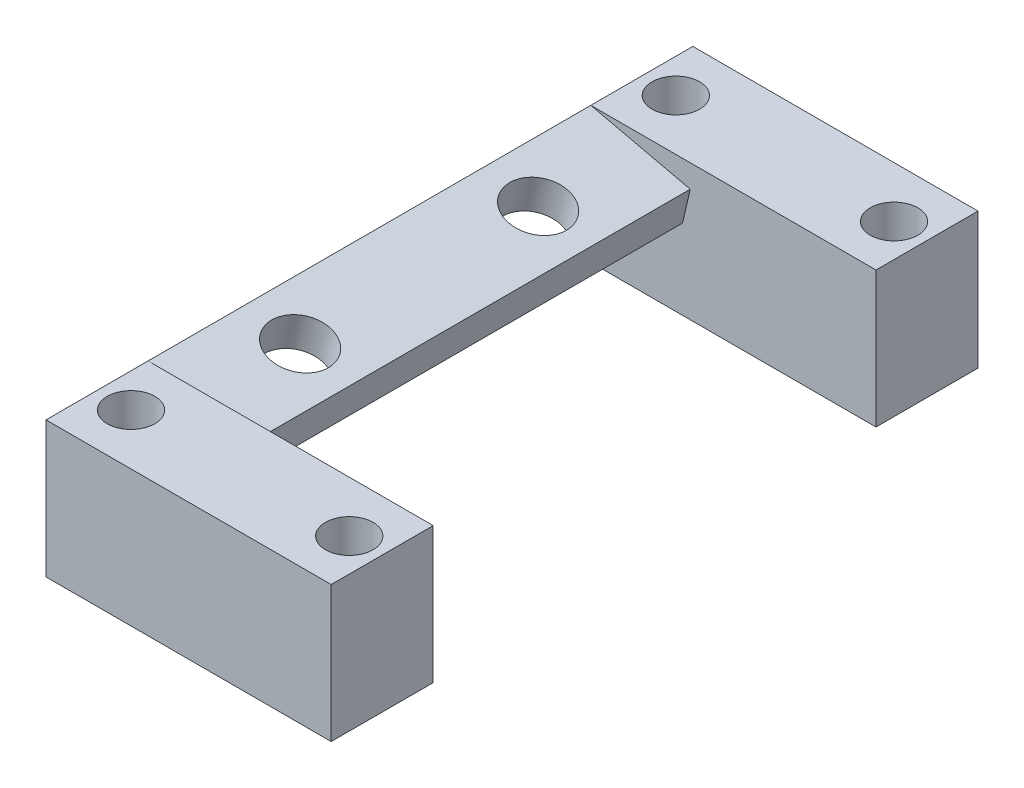
ISO-10303-21;
HEADER;
FILE_DESCRIPTION(('STEP AP214'),'2;1');
FILE_NAME('part.step','',(''),(''),'','','');
FILE_SCHEMA(('AUTOMOTIVE_DESIGN { 1 0 10303 214 1 1 1 1 }'));
ENDSEC;
DATA;
#1=APPLICATION_CONTEXT('core data for automotive mechanical design processes');
#2=APPLICATION_PROTOCOL_DEFINITION('international standard','automotive_design',2000,#1);
#3=PRODUCT_CONTEXT('',#1,'mechanical');
#4=PRODUCT('Part','Part','',(#3));
#5=PRODUCT_RELATED_PRODUCT_CATEGORY('part','',(#4));
#6=PRODUCT_DEFINITION_FORMATION('','',#4);
#7=PRODUCT_DEFINITION_CONTEXT('part definition',#1,'design');
#8=PRODUCT_DEFINITION('design','',#6,#7);
#9=PRODUCT_DEFINITION_SHAPE('','',#8);
#10=(LENGTH_UNIT() NAMED_UNIT(*) SI_UNIT(.MILLI.,.METRE.));
#11=(NAMED_UNIT(*) PLANE_ANGLE_UNIT() SI_UNIT($,.RADIAN.));
#12=(NAMED_UNIT(*) SI_UNIT($,.STERADIAN.) SOLID_ANGLE_UNIT());
#13=UNCERTAINTY_MEASURE_WITH_UNIT(LENGTH_MEASURE(1.E-05),#10,'distance_accuracy_value','');
#14=(GEOMETRIC_REPRESENTATION_CONTEXT(3) GLOBAL_UNCERTAINTY_ASSIGNED_CONTEXT((#13)) GLOBAL_UNIT_ASSIGNED_CONTEXT((#10,
#11,#12)) REPRESENTATION_CONTEXT('',''));
#15=CARTESIAN_POINT('',(0.,0.,0.));
#16=DIRECTION('',(0.,0.,1.));
#17=DIRECTION('',(1.,0.,0.));
#18=AXIS2_PLACEMENT_3D('',#15,#16,#17);
#19=CARTESIAN_POINT('',(-35.7075481721267,20.8555254386624,-40.6908));
#20=DIRECTION('',(1.,0.,0.));
#21=DIRECTION('',(0.,0.,-1.));
#22=AXIS2_PLACEMENT_3D('',#19,#20,#21);
#23=PLANE('',#22);
#24=DIRECTION('',(0.,1.,0.));
#25=VECTOR('',#24,1.);
#26=CARTESIAN_POINT('',(-35.7075481721267,20.8555254386624,-33.0708));
#27=LINE('',#26,#25);
#28=CARTESIAN_POINT('',(-35.7075481721267,10.6955254386624,-33.0708));
#29=VERTEX_POINT('',#28);
#30=CARTESIAN_POINT('',(-35.7075481721267,20.8555254386624,-33.0708));
#31=VERTEX_POINT('',#30);
#32=EDGE_CURVE('E106',#29,#31,#27,.T.);
#33=ORIENTED_EDGE('',*,*,#32,.T.);
#34=DIRECTION('',(0.,0.,1.));
#35=VECTOR('',#34,1.);
#36=CARTESIAN_POINT('',(-35.7075481721267,20.8555254386624,-40.6908));
#37=LINE('',#36,#35);
#38=CARTESIAN_POINT('',(-35.7075481721267,20.8555254386624,-40.6908));
#39=VERTEX_POINT('',#38);
#40=EDGE_CURVE('E12',#39,#31,#37,.T.);
#41=ORIENTED_EDGE('',*,*,#40,.F.);
#42=DIRECTION('',(0.,1.,0.));
#43=VECTOR('',#42,1.);
#44=CARTESIAN_POINT('',(-35.7075481721267,20.8555254386624,-40.6908));
#45=LINE('',#44,#43);
#46=CARTESIAN_POINT('',(-35.7075481721267,10.6955254386624,-40.6908));
#47=VERTEX_POINT('',#46);
#48=EDGE_CURVE('E94',#47,#39,#45,.T.);
#49=ORIENTED_EDGE('',*,*,#48,.F.);
#50=DIRECTION('',(0.,0.,1.));
#51=VECTOR('',#50,1.);
#52=CARTESIAN_POINT('',(-35.7075481721267,10.6955254386624,-40.6908));
#53=LINE('',#52,#51);
#54=EDGE_CURVE('E102',#47,#29,#53,.T.);
#55=ORIENTED_EDGE('',*,*,#54,.T.);
#56=EDGE_LOOP('',(#33,#41,#49,#55));
#57=FACE_BOUND('',#56,.T.);
#58=ADVANCED_FACE('F43',(#57),#23,.F.);
#59=CARTESIAN_POINT('',(-35.7075481721267,20.8555254386624,-40.6908));
#60=DIRECTION('',(0.,-1.,0.));
#61=DIRECTION('',(1.,0.,0.));
#62=AXIS2_PLACEMENT_3D('',#59,#60,#61);
#63=PLANE('',#62);
#64=CARTESIAN_POINT('',(-33.1675481721267,20.8555254386624,-36.8808));
#65=DIRECTION('',(0.,1.,0.));
#66=DIRECTION('',(-1.,0.,0.));
#67=AXIS2_PLACEMENT_3D('',#64,#65,#66);
#68=CIRCLE('',#67,1.778);
#69=CARTESIAN_POINT('',(-34.9455481721267,20.8555254386624,-36.8808));
#70=VERTEX_POINT('',#69);
#71=EDGE_CURVE('E126',#70,#70,#68,.T.);
#72=ORIENTED_EDGE('',*,*,#71,.F.);
#73=EDGE_LOOP('',(#72));
#74=FACE_BOUND('',#73,.T.);
#75=CARTESIAN_POINT('',(-16.8675477521267,20.8555254386624,-36.8808));
#76=DIRECTION('',(0.,1.,0.));
#77=DIRECTION('',(-1.,0.,0.));
#78=AXIS2_PLACEMENT_3D('',#75,#76,#77);
#79=CIRCLE('',#78,1.778);
#80=CARTESIAN_POINT('',(-18.6455477521267,20.8555254386624,-36.8808));
#81=VERTEX_POINT('',#80);
#82=EDGE_CURVE('E120',#81,#81,#79,.T.);
#83=ORIENTED_EDGE('',*,*,#82,.F.);
#84=EDGE_LOOP('',(#83));
#85=FACE_BOUND('',#84,.T.);
#86=DIRECTION('',(1.,0.,0.));
#87=VECTOR('',#86,1.);
#88=CARTESIAN_POINT('',(-35.7075481721267,20.8555254386624,-33.0708));
#89=LINE('',#88,#87);
#90=CARTESIAN_POINT('',(-14.4075475921267,20.8555254386624,-33.0708));
#91=VERTEX_POINT('',#90);
#92=EDGE_CURVE('E98',#31,#91,#89,.T.);
#93=ORIENTED_EDGE('',*,*,#92,.T.);
#94=DIRECTION('',(0.,0.,1.));
#95=VECTOR('',#94,1.);
#96=CARTESIAN_POINT('',(-14.4075475921267,20.8555254386624,-40.6908));
#97=LINE('',#96,#95);
#98=CARTESIAN_POINT('',(-14.4075475921267,20.8555254386624,-40.6908));
#99=VERTEX_POINT('',#98);
#100=EDGE_CURVE('E51',#99,#91,#97,.T.);
#101=ORIENTED_EDGE('',*,*,#100,.F.);
#102=DIRECTION('',(1.,0.,0.));
#103=VECTOR('',#102,1.);
#104=CARTESIAN_POINT('',(-35.7075481721267,20.8555254386624,-40.6908));
#105=LINE('',#104,#103);
#106=EDGE_CURVE('E89',#39,#99,#105,.T.);
#107=ORIENTED_EDGE('',*,*,#106,.F.);
#108=ORIENTED_EDGE('',*,*,#40,.T.);
#109=EDGE_LOOP('',(#93,#101,#107,#108));
#110=FACE_BOUND('',#109,.T.);
#111=ADVANCED_FACE('F97',(#74,#85,#110),#63,.F.);
#112=CARTESIAN_POINT('',(-14.4075475921267,20.8555254386624,-40.6908));
#113=DIRECTION('',(-1.,0.,0.));
#114=DIRECTION('',(0.,0.,1.));
#115=AXIS2_PLACEMENT_3D('',#112,#113,#114);
#116=PLANE('',#115);
#117=DIRECTION('',(0.,-1.,0.));
#118=VECTOR('',#117,1.);
#119=CARTESIAN_POINT('',(-14.4075475921267,20.8555254386624,-33.0708));
#120=LINE('',#119,#118);
#121=CARTESIAN_POINT('',(-14.4075475921267,10.6955254386624,-33.0708));
#122=VERTEX_POINT('',#121);
#123=EDGE_CURVE('E76',#91,#122,#120,.T.);
#124=ORIENTED_EDGE('',*,*,#123,.T.);
#125=DIRECTION('',(0.,0.,1.));
#126=VECTOR('',#125,1.);
#127=CARTESIAN_POINT('',(-14.4075475921267,10.6955254386624,-40.6908));
#128=LINE('',#127,#126);
#129=CARTESIAN_POINT('',(-14.4075475921267,10.6955254386624,-40.6908));
#130=VERTEX_POINT('',#129);
#131=EDGE_CURVE('E99',#130,#122,#128,.T.);
#132=ORIENTED_EDGE('',*,*,#131,.F.);
#133=DIRECTION('',(0.,-1.,0.));
#134=VECTOR('',#133,1.);
#135=CARTESIAN_POINT('',(-14.4075475921267,20.8555254386624,-40.6908));
#136=LINE('',#135,#134);
#137=EDGE_CURVE('E92',#99,#130,#136,.T.);
#138=ORIENTED_EDGE('',*,*,#137,.F.);
#139=ORIENTED_EDGE('',*,*,#100,.T.);
#140=EDGE_LOOP('',(#124,#132,#138,#139));
#141=FACE_BOUND('',#140,.T.);
#142=ADVANCED_FACE('F100',(#141),#116,.F.);
#143=CARTESIAN_POINT('',(-35.7075481721267,10.6955254386624,-40.6908));
#144=DIRECTION('',(0.,1.,0.));
#145=DIRECTION('',(-1.,0.,0.));
#146=AXIS2_PLACEMENT_3D('',#143,#144,#145);
#147=PLANE('',#146);
#148=CARTESIAN_POINT('',(-33.1675481721267,10.6955254386624,-36.8808));
#149=DIRECTION('',(0.,1.,0.));
#150=DIRECTION('',(-1.,0.,0.));
#151=AXIS2_PLACEMENT_3D('',#148,#149,#150);
#152=CIRCLE('',#151,1.778);
#153=CARTESIAN_POINT('',(-34.9455481721267,10.6955254386624,-36.8808));
#154=VERTEX_POINT('',#153);
#155=EDGE_CURVE('E109',#154,#154,#152,.T.);
#156=ORIENTED_EDGE('',*,*,#155,.T.);
#157=EDGE_LOOP('',(#156));
#158=FACE_BOUND('',#157,.T.);
#159=CARTESIAN_POINT('',(-16.8675477521267,10.6955254386624,-36.8808));
#160=DIRECTION('',(0.,1.,0.));
#161=DIRECTION('',(-1.,0.,0.));
#162=AXIS2_PLACEMENT_3D('',#159,#160,#161);
#163=CIRCLE('',#162,1.778);
#164=CARTESIAN_POINT('',(-18.6455477521267,10.6955254386624,-36.8808));
#165=VERTEX_POINT('',#164);
#166=EDGE_CURVE('E123',#165,#165,#163,.T.);
#167=ORIENTED_EDGE('',*,*,#166,.T.);
#168=EDGE_LOOP('',(#167));
#169=FACE_BOUND('',#168,.T.);
#170=DIRECTION('',(-1.,0.,0.));
#171=VECTOR('',#170,1.);
#172=CARTESIAN_POINT('',(-35.7075481721267,10.6955254386624,-33.0708));
#173=LINE('',#172,#171);
#174=EDGE_CURVE('E82',#122,#29,#173,.T.);
#175=ORIENTED_EDGE('',*,*,#174,.T.);
#176=ORIENTED_EDGE('',*,*,#54,.F.);
#177=DIRECTION('',(-1.,0.,0.));
#178=VECTOR('',#177,1.);
#179=CARTESIAN_POINT('',(-35.7075481721267,10.6955254386624,-40.6908));
#180=LINE('',#179,#178);
#181=EDGE_CURVE('E59',#130,#47,#180,.T.);
#182=ORIENTED_EDGE('',*,*,#181,.F.);
#183=ORIENTED_EDGE('',*,*,#131,.T.);
#184=EDGE_LOOP('',(#175,#176,#182,#183));
#185=FACE_BOUND('',#184,.T.);
#186=ADVANCED_FACE('F114',(#158,#169,#185),#147,.F.);
#187=CARTESIAN_POINT('',(0.,0.,-40.6908));
#188=DIRECTION('',(0.,0.,1.));
#189=DIRECTION('',(1.,0.,0.));
#190=AXIS2_PLACEMENT_3D('',#187,#188,#189);
#191=PLANE('',#190);
#192=ORIENTED_EDGE('',*,*,#48,.T.);
#193=ORIENTED_EDGE('',*,*,#106,.T.);
#194=ORIENTED_EDGE('',*,*,#137,.T.);
#195=ORIENTED_EDGE('',*,*,#181,.T.);
#196=EDGE_LOOP('',(#192,#193,#194,#195));
#197=FACE_BOUND('',#196,.T.);
#198=ADVANCED_FACE('F90',(#197),#191,.F.);
#199=CARTESIAN_POINT('',(0.,0.,-33.0708));
#200=DIRECTION('',(0.,0.,1.));
#201=DIRECTION('',(1.,0.,0.));
#202=AXIS2_PLACEMENT_3D('',#199,#200,#201);
#203=PLANE('',#202);
#204=ORIENTED_EDGE('',*,*,#32,.F.);
#205=ORIENTED_EDGE('',*,*,#174,.F.);
#206=ORIENTED_EDGE('',*,*,#123,.F.);
#207=ORIENTED_EDGE('',*,*,#92,.F.);
#208=EDGE_LOOP('',(#204,#205,#206,#207));
#209=FACE_BOUND('',#208,.T.);
#210=ADVANCED_FACE('F117',(#209),#203,.T.);
#211=CARTESIAN_POINT('',(-16.8675477521267,10.6955254386624,-36.8808));
#212=DIRECTION('',(0.,1.,0.));
#213=DIRECTION('',(-1.,0.,0.));
#214=AXIS2_PLACEMENT_3D('',#211,#212,#213);
#215=CYLINDRICAL_SURFACE('',#214,1.778);
#216=ORIENTED_EDGE('',*,*,#166,.F.);
#217=EDGE_LOOP('',(#216));
#218=FACE_BOUND('',#217,.T.);
#219=ORIENTED_EDGE('',*,*,#82,.T.);
#220=EDGE_LOOP('',(#219));
#221=FACE_BOUND('',#220,.T.);
#222=ADVANCED_FACE('F137',(#218,#221),#215,.F.);
#223=CARTESIAN_POINT('',(-33.1675481721267,10.6955254386624,-36.8808));
#224=DIRECTION('',(0.,1.,0.));
#225=DIRECTION('',(-1.,0.,0.));
#226=AXIS2_PLACEMENT_3D('',#223,#224,#225);
#227=CYLINDRICAL_SURFACE('',#226,1.778);
#228=ORIENTED_EDGE('',*,*,#155,.F.);
#229=EDGE_LOOP('',(#228));
#230=FACE_BOUND('',#229,.T.);
#231=ORIENTED_EDGE('',*,*,#71,.T.);
#232=EDGE_LOOP('',(#231));
#233=FACE_BOUND('',#232,.T.);
#234=ADVANCED_FACE('F134',(#230,#233),#227,.F.);
#235=CLOSED_SHELL('',(#58,#111,#142,#186,#198,#210,#222,#234));
#236=MANIFOLD_SOLID_BREP('B2',#235);
#237=CARTESIAN_POINT('',(0.,0.,0.));
#238=DIRECTION('',(0.,0.,1.));
#239=DIRECTION('',(1.,0.,0.));
#240=AXIS2_PLACEMENT_3D('',#237,#238,#239);
#241=PLANE('',#240);
#242=DIRECTION('',(0.974370064785235,-0.224951054343866,0.));
#243=VECTOR('',#242,1.);
#244=CARTESIAN_POINT('',(-28.2828482784633,19.1413984045622,0.));
#245=LINE('',#244,#243);
#246=CARTESIAN_POINT('',(-35.7075481721267,20.8555254386624,0.));
#247=VERTEX_POINT('',#246);
#248=CARTESIAN_POINT('',(-28.2828482784633,19.1413984045622,0.));
#249=VERTEX_POINT('',#248);
#250=EDGE_CURVE('E292',#247,#249,#245,.T.);
#251=ORIENTED_EDGE('',*,*,#250,.F.);
#252=DIRECTION('',(-1.,0.,0.));
#253=VECTOR('',#252,1.);
#254=CARTESIAN_POINT('',(-35.7075481721267,20.8555254386624,0.));
#255=LINE('',#254,#253);
#256=CARTESIAN_POINT('',(-14.4075475921267,20.8555254386624,0.));
#257=VERTEX_POINT('',#256);
#258=EDGE_CURVE('E307',#257,#247,#255,.T.);
#259=ORIENTED_EDGE('',*,*,#258,.F.);
#260=DIRECTION('',(0.,1.,0.));
#261=VECTOR('',#260,1.);
#262=CARTESIAN_POINT('',(-14.4075475921267,20.8555254386624,0.));
#263=LINE('',#262,#261);
#264=CARTESIAN_POINT('',(-14.4075475921267,10.6955254386624,0.));
#265=VERTEX_POINT('',#264);
#266=EDGE_CURVE('E316',#265,#257,#263,.T.);
#267=ORIENTED_EDGE('',*,*,#266,.F.);
#268=DIRECTION('',(1.,0.,0.));
#269=VECTOR('',#268,1.);
#270=CARTESIAN_POINT('',(-35.7075481721267,10.6955254386624,0.));
#271=LINE('',#270,#269);
#272=CARTESIAN_POINT('',(-35.7075481721267,10.6955254386624,0.));
#273=VERTEX_POINT('',#272);
#274=EDGE_CURVE('E314',#273,#265,#271,.T.);
#275=ORIENTED_EDGE('',*,*,#274,.F.);
#276=DIRECTION('',(0.,-1.,0.));
#277=VECTOR('',#276,1.);
#278=CARTESIAN_POINT('',(-35.7075481721267,20.8555254386624,0.));
#279=LINE('',#278,#277);
#280=CARTESIAN_POINT('',(-35.7075481721267,18.2487130048672,0.));
#281=VERTEX_POINT('',#280);
#282=EDGE_CURVE('E295',#281,#273,#279,.T.);
#283=ORIENTED_EDGE('',*,*,#282,.F.);
#284=DIRECTION('',(-0.974370064785235,0.224951054343865,0.));
#285=VECTOR('',#284,1.);
#286=CARTESIAN_POINT('',(-28.8542239564967,16.6664984400077,0.));
#287=LINE('',#286,#285);
#288=CARTESIAN_POINT('',(-28.8542239564967,16.6664984400077,0.));
#289=VERTEX_POINT('',#288);
#290=EDGE_CURVE('E229',#289,#281,#287,.T.);
#291=ORIENTED_EDGE('',*,*,#290,.F.);
#292=DIRECTION('',(-0.224951054343866,-0.974370064785235,0.));
#293=VECTOR('',#292,1.);
#294=CARTESIAN_POINT('',(-28.2828482784633,19.1413984045622,0.));
#295=LINE('',#294,#293);
#296=EDGE_CURVE('E224',#249,#289,#295,.T.);
#297=ORIENTED_EDGE('',*,*,#296,.F.);
#298=EDGE_LOOP('',(#251,#259,#267,#275,#283,#291,#297));
#299=FACE_BOUND('',#298,.T.);
#300=ADVANCED_FACE('F209',(#299),#241,.F.);
#301=CARTESIAN_POINT('',(-35.7075481721267,20.8555254386624,7.62));
#302=DIRECTION('',(1.,0.,0.));
#303=DIRECTION('',(0.,1.,0.));
#304=AXIS2_PLACEMENT_3D('',#301,#302,#303);
#305=PLANE('',#304);
#306=EDGE_CURVE('E297',#247,#281,#279,.T.);
#307=ORIENTED_EDGE('',*,*,#306,.T.);
#308=ORIENTED_EDGE('',*,*,#282,.T.);
#309=DIRECTION('',(0.,0.,-1.));
#310=VECTOR('',#309,1.);
#311=CARTESIAN_POINT('',(-35.7075481721267,10.6955254386624,7.62));
#312=LINE('',#311,#310);
#313=CARTESIAN_POINT('',(-35.7075481721267,10.6955254386624,7.62));
#314=VERTEX_POINT('',#313);
#315=EDGE_CURVE('E41',#314,#273,#312,.T.);
#316=ORIENTED_EDGE('',*,*,#315,.F.);
#317=DIRECTION('',(0.,-1.,0.));
#318=VECTOR('',#317,1.);
#319=CARTESIAN_POINT('',(-35.7075481721267,20.8555254386624,7.62));
#320=LINE('',#319,#318);
#321=CARTESIAN_POINT('',(-35.7075481721267,20.8555254386624,7.62));
#322=VERTEX_POINT('',#321);
#323=EDGE_CURVE('E303',#322,#314,#320,.T.);
#324=ORIENTED_EDGE('',*,*,#323,.F.);
#325=DIRECTION('',(0.,0.,-1.));
#326=VECTOR('',#325,1.);
#327=CARTESIAN_POINT('',(-35.7075481721267,20.8555254386624,7.62));
#328=LINE('',#327,#326);
#329=EDGE_CURVE('E312',#322,#247,#328,.T.);
#330=ORIENTED_EDGE('',*,*,#329,.T.);
#331=EDGE_LOOP('',(#307,#308,#316,#324,#330));
#332=FACE_BOUND('',#331,.T.);
#333=ADVANCED_FACE('F211',(#332),#305,.F.);
#334=CARTESIAN_POINT('',(-35.7075481721267,10.6955254386624,7.62));
#335=DIRECTION('',(0.,1.,0.));
#336=DIRECTION('',(0.,0.,1.));
#337=AXIS2_PLACEMENT_3D('',#334,#335,#336);
#338=PLANE('',#337);
#339=CARTESIAN_POINT('',(-33.1675481721267,10.6955254386624,3.81));
#340=DIRECTION('',(0.,1.,0.));
#341=DIRECTION('',(0.,0.,1.));
#342=AXIS2_PLACEMENT_3D('',#339,#340,#341);
#343=CIRCLE('',#342,1.778);
#344=CARTESIAN_POINT('',(-33.1675481721267,10.6955254386624,5.588));
#345=VERTEX_POINT('',#344);
#346=EDGE_CURVE('E362',#345,#345,#343,.T.);
#347=ORIENTED_EDGE('',*,*,#346,.T.);
#348=EDGE_LOOP('',(#347));
#349=FACE_BOUND('',#348,.T.);
#350=CARTESIAN_POINT('',(-16.8675477521267,10.6955254386624,3.81));
#351=DIRECTION('',(0.,1.,0.));
#352=DIRECTION('',(0.,0.,1.));
#353=AXIS2_PLACEMENT_3D('',#350,#351,#352);
#354=CIRCLE('',#353,1.778);
#355=CARTESIAN_POINT('',(-16.8675477521267,10.6955254386624,5.588));
#356=VERTEX_POINT('',#355);
#357=EDGE_CURVE('E368',#356,#356,#354,.T.);
#358=ORIENTED_EDGE('',*,*,#357,.T.);
#359=EDGE_LOOP('',(#358));
#360=FACE_BOUND('',#359,.T.);
#361=ORIENTED_EDGE('',*,*,#274,.T.);
#362=DIRECTION('',(0.,0.,-1.));
#363=VECTOR('',#362,1.);
#364=CARTESIAN_POINT('',(-14.4075475921267,10.6955254386624,7.62));
#365=LINE('',#364,#363);
#366=CARTESIAN_POINT('',(-14.4075475921267,10.6955254386624,7.62));
#367=VERTEX_POINT('',#366);
#368=EDGE_CURVE('E217',#367,#265,#365,.T.);
#369=ORIENTED_EDGE('',*,*,#368,.F.);
#370=DIRECTION('',(1.,0.,0.));
#371=VECTOR('',#370,1.);
#372=CARTESIAN_POINT('',(-35.7075481721267,10.6955254386624,7.62));
#373=LINE('',#372,#371);
#374=EDGE_CURVE('E306',#314,#367,#373,.T.);
#375=ORIENTED_EDGE('',*,*,#374,.F.);
#376=ORIENTED_EDGE('',*,*,#315,.T.);
#377=EDGE_LOOP('',(#361,#369,#375,#376));
#378=FACE_BOUND('',#377,.T.);
#379=ADVANCED_FACE('F419',(#349,#360,#378),#338,.F.);
#380=CARTESIAN_POINT('',(-14.4075475921267,20.8555254386624,7.62));
#381=DIRECTION('',(-1.,0.,0.));
#382=DIRECTION('',(0.,-1.,0.));
#383=AXIS2_PLACEMENT_3D('',#380,#381,#382);
#384=PLANE('',#383);
#385=ORIENTED_EDGE('',*,*,#266,.T.);
#386=DIRECTION('',(0.,0.,-1.));
#387=VECTOR('',#386,1.);
#388=CARTESIAN_POINT('',(-14.4075475921267,20.8555254386624,7.62));
#389=LINE('',#388,#387);
#390=CARTESIAN_POINT('',(-14.4075475921267,20.8555254386624,7.62));
#391=VERTEX_POINT('',#390);
#392=EDGE_CURVE('E322',#391,#257,#389,.T.);
#393=ORIENTED_EDGE('',*,*,#392,.F.);
#394=DIRECTION('',(0.,1.,0.));
#395=VECTOR('',#394,1.);
#396=CARTESIAN_POINT('',(-14.4075475921267,20.8555254386624,7.62));
#397=LINE('',#396,#395);
#398=EDGE_CURVE('E309',#367,#391,#397,.T.);
#399=ORIENTED_EDGE('',*,*,#398,.F.);
#400=ORIENTED_EDGE('',*,*,#368,.T.);
#401=EDGE_LOOP('',(#385,#393,#399,#400));
#402=FACE_BOUND('',#401,.T.);
#403=ADVANCED_FACE('F329',(#402),#384,.F.);
#404=CARTESIAN_POINT('',(-35.7075481721267,20.8555254386624,7.62));
#405=DIRECTION('',(0.,-1.,0.));
#406=DIRECTION('',(0.,0.,-1.));
#407=AXIS2_PLACEMENT_3D('',#404,#405,#406);
#408=PLANE('',#407);
#409=CARTESIAN_POINT('',(-33.1675481721267,20.8555254386624,3.81));
#410=DIRECTION('',(0.,1.,0.));
#411=DIRECTION('',(0.,0.,1.));
#412=AXIS2_PLACEMENT_3D('',#409,#410,#411);
#413=CIRCLE('',#412,1.778);
#414=CARTESIAN_POINT('',(-33.1675481721267,20.8555254386624,5.588));
#415=VERTEX_POINT('',#414);
#416=EDGE_CURVE('E372',#415,#415,#413,.T.);
#417=ORIENTED_EDGE('',*,*,#416,.F.);
#418=EDGE_LOOP('',(#417));
#419=FACE_BOUND('',#418,.T.);
#420=CARTESIAN_POINT('',(-16.8675477521267,20.8555254386624,3.81));
#421=DIRECTION('',(0.,1.,0.));
#422=DIRECTION('',(0.,0.,1.));
#423=AXIS2_PLACEMENT_3D('',#420,#421,#422);
#424=CIRCLE('',#423,1.778);
#425=CARTESIAN_POINT('',(-16.8675477521267,20.8555254386624,5.588));
#426=VERTEX_POINT('',#425);
#427=EDGE_CURVE('E365',#426,#426,#424,.T.);
#428=ORIENTED_EDGE('',*,*,#427,.F.);
#429=EDGE_LOOP('',(#428));
#430=FACE_BOUND('',#429,.T.);
#431=ORIENTED_EDGE('',*,*,#258,.T.);
#432=ORIENTED_EDGE('',*,*,#329,.F.);
#433=DIRECTION('',(-1.,0.,0.));
#434=VECTOR('',#433,1.);
#435=CARTESIAN_POINT('',(-35.7075481721267,20.8555254386624,7.62));
#436=LINE('',#435,#434);
#437=EDGE_CURVE('E311',#391,#322,#436,.T.);
#438=ORIENTED_EDGE('',*,*,#437,.F.);
#439=ORIENTED_EDGE('',*,*,#392,.T.);
#440=EDGE_LOOP('',(#431,#432,#438,#439));
#441=FACE_BOUND('',#440,.T.);
#442=ADVANCED_FACE('F336',(#419,#430,#441),#408,.F.);
#443=CARTESIAN_POINT('',(0.,0.,7.62));
#444=DIRECTION('',(0.,0.,1.));
#445=DIRECTION('',(1.,0.,0.));
#446=AXIS2_PLACEMENT_3D('',#443,#444,#445);
#447=PLANE('',#446);
#448=ORIENTED_EDGE('',*,*,#323,.T.);
#449=ORIENTED_EDGE('',*,*,#374,.T.);
#450=ORIENTED_EDGE('',*,*,#398,.T.);
#451=ORIENTED_EDGE('',*,*,#437,.T.);
#452=EDGE_LOOP('',(#448,#449,#450,#451));
#453=FACE_BOUND('',#452,.T.);
#454=ADVANCED_FACE('F422',(#453),#447,.T.);
#455=CARTESIAN_POINT('',(-28.2828482784633,19.1413984045622,-33.0708));
#456=DIRECTION('',(-0.974370064785235,0.224951054343866,0.));
#457=DIRECTION('',(-0.224951054343866,-0.974370064785235,0.));
#458=AXIS2_PLACEMENT_3D('',#455,#456,#457);
#459=PLANE('',#458);
#460=ORIENTED_EDGE('',*,*,#296,.T.);
#461=DIRECTION('',(0.,0.,1.));
#462=VECTOR('',#461,1.);
#463=CARTESIAN_POINT('',(-28.8542239564967,16.6664984400077,-33.0708));
#464=LINE('',#463,#462);
#465=CARTESIAN_POINT('',(-28.8542239564967,16.6664984400077,-33.0708));
#466=VERTEX_POINT('',#465);
#467=EDGE_CURVE('E277',#466,#289,#464,.T.);
#468=ORIENTED_EDGE('',*,*,#467,.F.);
#469=DIRECTION('',(-0.224951054343866,-0.974370064785235,0.));
#470=VECTOR('',#469,1.);
#471=CARTESIAN_POINT('',(-28.2828482784633,19.1413984045622,-33.0708));
#472=LINE('',#471,#470);
#473=CARTESIAN_POINT('',(-28.2828482784633,19.1413984045622,-33.0708));
#474=VERTEX_POINT('',#473);
#475=EDGE_CURVE('E283',#474,#466,#472,.T.);
#476=ORIENTED_EDGE('',*,*,#475,.F.);
#477=DIRECTION('',(0.,0.,1.));
#478=VECTOR('',#477,1.);
#479=CARTESIAN_POINT('',(-28.2828482784633,19.1413984045622,-33.0708));
#480=LINE('',#479,#478);
#481=EDGE_CURVE('E356',#474,#249,#480,.T.);
#482=ORIENTED_EDGE('',*,*,#481,.T.);
#483=EDGE_LOOP('',(#460,#468,#476,#482));
#484=FACE_BOUND('',#483,.T.);
#485=ADVANCED_FACE('F294',(#484),#459,.F.);
#486=CARTESIAN_POINT('',(-28.8542239564967,16.6664984400077,-33.0708));
#487=DIRECTION('',(0.224951054343865,0.974370064785235,0.));
#488=DIRECTION('',(-0.974370064785235,0.224951054343865,0.));
#489=AXIS2_PLACEMENT_3D('',#486,#487,#488);
#490=PLANE('',#489);
#491=CARTESIAN_POINT('',(-32.5665739033284,17.5235619570578,-7.6454));
#492=DIRECTION('',(0.224951054343866,0.974370064785235,0.));
#493=DIRECTION('',(-0.974370064785235,0.224951054343866,0.));
#494=AXIS2_PLACEMENT_3D('',#491,#492,#493);
#495=CIRCLE('',#494,2.17169999999999);
#496=CARTESIAN_POINT('',(-34.6826133730225,18.0120881617764,-7.6454));
#497=VERTEX_POINT('',#496);
#498=EDGE_CURVE('E369',#497,#497,#495,.T.);
#499=ORIENTED_EDGE('',*,*,#498,.T.);
#500=EDGE_LOOP('',(#499));
#501=FACE_BOUND('',#500,.T.);
#502=CARTESIAN_POINT('',(-32.5665739033284,17.5235619570578,-25.4254));
#503=DIRECTION('',(0.224951054343866,0.974370064785235,0.));
#504=DIRECTION('',(-0.974370064785235,0.224951054343866,0.));
#505=AXIS2_PLACEMENT_3D('',#502,#503,#504);
#506=CIRCLE('',#505,2.17169999999999);
#507=CARTESIAN_POINT('',(-34.6826133730225,18.0120881617764,-25.4254));
#508=VERTEX_POINT('',#507);
#509=EDGE_CURVE('E380',#508,#508,#506,.T.);
#510=ORIENTED_EDGE('',*,*,#509,.T.);
#511=EDGE_LOOP('',(#510));
#512=FACE_BOUND('',#511,.T.);
#513=ORIENTED_EDGE('',*,*,#290,.T.);
#514=CARTESIAN_POINT('',(-36.2789238501602,18.3806254741079,0.));
#515=VERTEX_POINT('',#514);
#516=EDGE_CURVE('E348',#281,#515,#287,.T.);
#517=ORIENTED_EDGE('',*,*,#516,.T.);
#518=DIRECTION('',(0.,0.,1.));
#519=VECTOR('',#518,1.);
#520=CARTESIAN_POINT('',(-36.2789238501602,18.3806254741079,-33.0708));
#521=LINE('',#520,#519);
#522=CARTESIAN_POINT('',(-36.2789238501602,18.3806254741079,-33.0708));
#523=VERTEX_POINT('',#522);
#524=EDGE_CURVE('E279',#523,#515,#521,.T.);
#525=ORIENTED_EDGE('',*,*,#524,.F.);
#526=DIRECTION('',(-0.974370064785235,0.224951054343865,0.));
#527=VECTOR('',#526,1.);
#528=CARTESIAN_POINT('',(-28.8542239564967,16.6664984400077,-33.0708));
#529=LINE('',#528,#527);
#530=EDGE_CURVE('E273',#466,#523,#529,.T.);
#531=ORIENTED_EDGE('',*,*,#530,.F.);
#532=ORIENTED_EDGE('',*,*,#467,.T.);
#533=EDGE_LOOP('',(#513,#517,#525,#531,#532));
#534=FACE_BOUND('',#533,.T.);
#535=ADVANCED_FACE('F275',(#501,#512,#534),#490,.F.);
#536=CARTESIAN_POINT('',(-35.7075481721267,20.8555254386624,-33.0708));
#537=DIRECTION('',(0.974370064785235,-0.224951054343866,0.));
#538=DIRECTION('',(0.224951054343866,0.974370064785235,0.));
#539=AXIS2_PLACEMENT_3D('',#536,#537,#538);
#540=PLANE('',#539);
#541=DIRECTION('',(0.224951054343865,0.974370064785235,0.));
#542=VECTOR('',#541,1.);
#543=CARTESIAN_POINT('',(-35.7075481721267,20.8555254386624,0.));
#544=LINE('',#543,#542);
#545=EDGE_CURVE('E347',#515,#247,#544,.T.);
#546=ORIENTED_EDGE('',*,*,#545,.T.);
#547=DIRECTION('',(0.,0.,1.));
#548=VECTOR('',#547,1.);
#549=CARTESIAN_POINT('',(-35.7075481721267,20.8555254386624,-33.0708));
#550=LINE('',#549,#548);
#551=CARTESIAN_POINT('',(-35.7075481721267,20.8555254386624,-33.0708));
#552=VERTEX_POINT('',#551);
#553=EDGE_CURVE('E299',#552,#247,#550,.T.);
#554=ORIENTED_EDGE('',*,*,#553,.F.);
#555=DIRECTION('',(0.224951054343865,0.974370064785235,0.));
#556=VECTOR('',#555,1.);
#557=CARTESIAN_POINT('',(-35.7075481721267,20.8555254386624,-33.0708));
#558=LINE('',#557,#556);
#559=EDGE_CURVE('E282',#523,#552,#558,.T.);
#560=ORIENTED_EDGE('',*,*,#559,.F.);
#561=ORIENTED_EDGE('',*,*,#524,.T.);
#562=EDGE_LOOP('',(#546,#554,#560,#561));
#563=FACE_BOUND('',#562,.T.);
#564=ADVANCED_FACE('F352',(#563),#540,.F.);
#565=CARTESIAN_POINT('',(-28.2828482784633,19.1413984045622,-33.0708));
#566=DIRECTION('',(-0.224951054343866,-0.974370064785235,0.));
#567=DIRECTION('',(0.974370064785235,-0.224951054343866,0.));
#568=AXIS2_PLACEMENT_3D('',#565,#566,#567);
#569=PLANE('',#568);
#570=CARTESIAN_POINT('',(-31.995198225295,19.9984619216123,-7.6454));
#571=DIRECTION('',(0.224951054343866,0.974370064785235,0.));
#572=DIRECTION('',(-0.974370064785235,0.224951054343866,0.));
#573=AXIS2_PLACEMENT_3D('',#570,#571,#572);
#574=CIRCLE('',#573,2.17169999999999);
#575=CARTESIAN_POINT('',(-34.1112376949891,20.4869881263309,-7.6454));
#576=VERTEX_POINT('',#575);
#577=EDGE_CURVE('E383',#576,#576,#574,.T.);
#578=ORIENTED_EDGE('',*,*,#577,.F.);
#579=EDGE_LOOP('',(#578));
#580=FACE_BOUND('',#579,.T.);
#581=CARTESIAN_POINT('',(-31.995198225295,19.9984619216123,-25.4254));
#582=DIRECTION('',(0.224951054343866,0.974370064785235,0.));
#583=DIRECTION('',(-0.974370064785235,0.224951054343866,0.));
#584=AXIS2_PLACEMENT_3D('',#581,#582,#583);
#585=CIRCLE('',#584,2.17169999999999);
#586=CARTESIAN_POINT('',(-34.1112376949891,20.4869881263309,-25.4254));
#587=VERTEX_POINT('',#586);
#588=EDGE_CURVE('E377',#587,#587,#585,.T.);
#589=ORIENTED_EDGE('',*,*,#588,.F.);
#590=EDGE_LOOP('',(#589));
#591=FACE_BOUND('',#590,.T.);
#592=ORIENTED_EDGE('',*,*,#250,.T.);
#593=ORIENTED_EDGE('',*,*,#481,.F.);
#594=DIRECTION('',(0.974370064785235,-0.224951054343866,0.));
#595=VECTOR('',#594,1.);
#596=CARTESIAN_POINT('',(-28.2828482784633,19.1413984045622,-33.0708));
#597=LINE('',#596,#595);
#598=EDGE_CURVE('E288',#552,#474,#597,.T.);
#599=ORIENTED_EDGE('',*,*,#598,.F.);
#600=ORIENTED_EDGE('',*,*,#553,.T.);
#601=EDGE_LOOP('',(#592,#593,#599,#600));
#602=FACE_BOUND('',#601,.T.);
#603=ADVANCED_FACE('F355',(#580,#591,#602),#569,.F.);
#604=CARTESIAN_POINT('',(0.,0.,-33.0708));
#605=DIRECTION('',(0.,0.,-1.));
#606=DIRECTION('',(-1.,0.,0.));
#607=AXIS2_PLACEMENT_3D('',#604,#605,#606);
#608=PLANE('',#607);
#609=ORIENTED_EDGE('',*,*,#475,.T.);
#610=ORIENTED_EDGE('',*,*,#530,.T.);
#611=ORIENTED_EDGE('',*,*,#559,.T.);
#612=ORIENTED_EDGE('',*,*,#598,.T.);
#613=EDGE_LOOP('',(#609,#610,#611,#612));
#614=FACE_BOUND('',#613,.T.);
#615=ADVANCED_FACE('F286',(#614),#608,.T.);
#616=CARTESIAN_POINT('',(0.,0.,0.));
#617=DIRECTION('',(0.,0.,-1.));
#618=DIRECTION('',(-1.,0.,0.));
#619=AXIS2_PLACEMENT_3D('',#616,#617,#618);
#620=PLANE('',#619);
#621=ORIENTED_EDGE('',*,*,#306,.F.);
#622=ORIENTED_EDGE('',*,*,#545,.F.);
#623=ORIENTED_EDGE('',*,*,#516,.F.);
#624=EDGE_LOOP('',(#621,#622,#623));
#625=FACE_BOUND('',#624,.T.);
#626=ADVANCED_FACE('F346',(#625),#620,.F.);
#627=CARTESIAN_POINT('',(-16.8675477521267,10.6955254386624,3.81));
#628=DIRECTION('',(0.,1.,0.));
#629=DIRECTION('',(0.,0.,1.));
#630=AXIS2_PLACEMENT_3D('',#627,#628,#629);
#631=CYLINDRICAL_SURFACE('',#630,1.778);
#632=ORIENTED_EDGE('',*,*,#357,.F.);
#633=EDGE_LOOP('',(#632));
#634=FACE_BOUND('',#633,.T.);
#635=ORIENTED_EDGE('',*,*,#427,.T.);
#636=EDGE_LOOP('',(#635));
#637=FACE_BOUND('',#636,.T.);
#638=ADVANCED_FACE('F410',(#634,#637),#631,.F.);
#639=CARTESIAN_POINT('',(-33.1675481721267,10.6955254386624,3.81));
#640=DIRECTION('',(0.,1.,0.));
#641=DIRECTION('',(0.,0.,1.));
#642=AXIS2_PLACEMENT_3D('',#639,#640,#641);
#643=CYLINDRICAL_SURFACE('',#642,1.778);
#644=ORIENTED_EDGE('',*,*,#346,.F.);
#645=EDGE_LOOP('',(#644));
#646=FACE_BOUND('',#645,.T.);
#647=ORIENTED_EDGE('',*,*,#416,.T.);
#648=EDGE_LOOP('',(#647));
#649=FACE_BOUND('',#648,.T.);
#650=ADVANCED_FACE('F404',(#646,#649),#643,.F.);
#651=CARTESIAN_POINT('',(-32.5665739033284,17.5235619570578,-25.4254));
#652=DIRECTION('',(0.224951054343866,0.974370064785235,0.));
#653=DIRECTION('',(-0.974370064785235,0.224951054343866,0.));
#654=AXIS2_PLACEMENT_3D('',#651,#652,#653);
#655=CYLINDRICAL_SURFACE('',#654,2.17169999999999);
#656=ORIENTED_EDGE('',*,*,#509,.F.);
#657=EDGE_LOOP('',(#656));
#658=FACE_BOUND('',#657,.T.);
#659=ORIENTED_EDGE('',*,*,#588,.T.);
#660=EDGE_LOOP('',(#659));
#661=FACE_BOUND('',#660,.T.);
#662=ADVANCED_FACE('F394',(#658,#661),#655,.F.);
#663=CARTESIAN_POINT('',(-32.5665739033284,17.5235619570578,-7.6454));
#664=DIRECTION('',(0.224951054343866,0.974370064785235,0.));
#665=DIRECTION('',(-0.974370064785235,0.224951054343866,0.));
#666=AXIS2_PLACEMENT_3D('',#663,#664,#665);
#667=CYLINDRICAL_SURFACE('',#666,2.17169999999999);
#668=ORIENTED_EDGE('',*,*,#498,.F.);
#669=EDGE_LOOP('',(#668));
#670=FACE_BOUND('',#669,.T.);
#671=ORIENTED_EDGE('',*,*,#577,.T.);
#672=EDGE_LOOP('',(#671));
#673=FACE_BOUND('',#672,.T.);
#674=ADVANCED_FACE('F391',(#670,#673),#667,.F.);
#675=CLOSED_SHELL('',(#300,#333,#379,#403,#442,#454,#485,#535,#564,#603,#615,#626,#638,#650,
#662,#674));
#676=MANIFOLD_SOLID_BREP('B6',#675);
#677=ADVANCED_BREP_SHAPE_REPRESENTATION('',(#18,#236,#676),#14);
#678=SHAPE_DEFINITION_REPRESENTATION(#9,#677);
ENDSEC;
END-ISO-10303-21;
